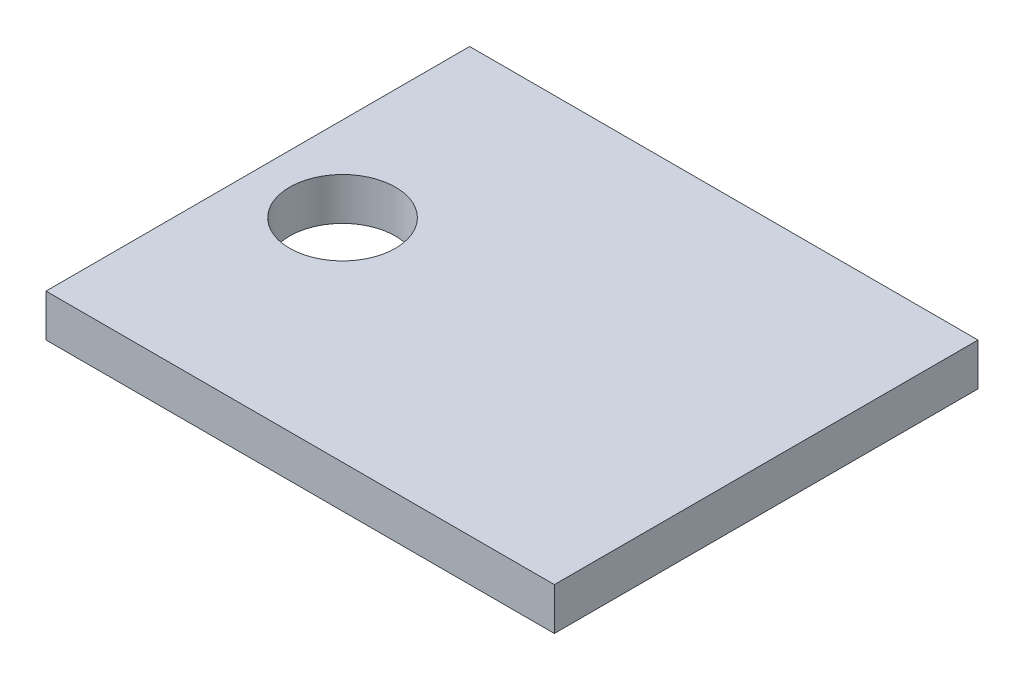
ISO-10303-21;
HEADER;
FILE_DESCRIPTION(('STEP AP214'),'2;1');
FILE_NAME('part.step','',(''),(''),'','','');
FILE_SCHEMA(('AUTOMOTIVE_DESIGN { 1 0 10303 214 1 1 1 1 }'));
ENDSEC;
DATA;
#1=APPLICATION_CONTEXT('core data for automotive mechanical design processes');
#2=APPLICATION_PROTOCOL_DEFINITION('international standard','automotive_design',2000,#1);
#3=PRODUCT_CONTEXT('',#1,'mechanical');
#4=PRODUCT('Part','Part','',(#3));
#5=PRODUCT_RELATED_PRODUCT_CATEGORY('part','',(#4));
#6=PRODUCT_DEFINITION_FORMATION('','',#4);
#7=PRODUCT_DEFINITION_CONTEXT('part definition',#1,'design');
#8=PRODUCT_DEFINITION('design','',#6,#7);
#9=PRODUCT_DEFINITION_SHAPE('','',#8);
#10=(LENGTH_UNIT() NAMED_UNIT(*) SI_UNIT(.MILLI.,.METRE.));
#11=(NAMED_UNIT(*) PLANE_ANGLE_UNIT() SI_UNIT($,.RADIAN.));
#12=(NAMED_UNIT(*) SI_UNIT($,.STERADIAN.) SOLID_ANGLE_UNIT());
#13=UNCERTAINTY_MEASURE_WITH_UNIT(LENGTH_MEASURE(1.E-05),#10,'distance_accuracy_value','');
#14=(GEOMETRIC_REPRESENTATION_CONTEXT(3) GLOBAL_UNCERTAINTY_ASSIGNED_CONTEXT((#13)) GLOBAL_UNIT_ASSIGNED_CONTEXT((#10,
#11,#12)) REPRESENTATION_CONTEXT('',''));
#15=CARTESIAN_POINT('',(0.,0.,0.));
#16=DIRECTION('',(0.,0.,1.));
#17=DIRECTION('',(1.,0.,0.));
#18=AXIS2_PLACEMENT_3D('',#15,#16,#17);
#19=CARTESIAN_POINT('',(0.,5.,0.));
#20=DIRECTION('',(0.,-1.,0.));
#21=DIRECTION('',(0.,0.,-1.));
#22=AXIS2_PLACEMENT_3D('',#19,#20,#21);
#23=PLANE('',#22);
#24=DIRECTION('',(0.,0.,-1.));
#25=VECTOR('',#24,1.);
#26=CARTESIAN_POINT('',(60.,5.,50.));
#27=LINE('',#26,#25);
#28=CARTESIAN_POINT('',(60.,5.,50.));
#29=VERTEX_POINT('',#28);
#30=CARTESIAN_POINT('',(60.,5.,-50.));
#31=VERTEX_POINT('',#30);
#32=EDGE_CURVE('E89',#29,#31,#27,.T.);
#33=ORIENTED_EDGE('',*,*,#32,.T.);
#34=DIRECTION('',(-1.,0.,0.));
#35=VECTOR('',#34,1.);
#36=CARTESIAN_POINT('',(-60.,5.,-50.));
#37=LINE('',#36,#35);
#38=CARTESIAN_POINT('',(-60.,5.,-50.));
#39=VERTEX_POINT('',#38);
#40=EDGE_CURVE('E84',#31,#39,#37,.T.);
#41=ORIENTED_EDGE('',*,*,#40,.T.);
#42=DIRECTION('',(0.,0.,1.));
#43=VECTOR('',#42,1.);
#44=CARTESIAN_POINT('',(-60.,5.,50.));
#45=LINE('',#44,#43);
#46=CARTESIAN_POINT('',(-60.,5.,50.));
#47=VERTEX_POINT('',#46);
#48=EDGE_CURVE('E87',#39,#47,#45,.T.);
#49=ORIENTED_EDGE('',*,*,#48,.T.);
#50=DIRECTION('',(1.,0.,0.));
#51=VECTOR('',#50,1.);
#52=CARTESIAN_POINT('',(-60.,5.,50.));
#53=LINE('',#52,#51);
#54=EDGE_CURVE('E54',#47,#29,#53,.T.);
#55=ORIENTED_EDGE('',*,*,#54,.T.);
#56=EDGE_LOOP('',(#33,#41,#49,#55));
#57=FACE_BOUND('',#56,.T.);
#58=CARTESIAN_POINT('',(-40.,5.,0.));
#59=DIRECTION('',(0.,1.,0.));
#60=DIRECTION('',(0.,0.,1.));
#61=AXIS2_PLACEMENT_3D('',#58,#59,#60);
#62=CIRCLE('',#61,12.5);
#63=CARTESIAN_POINT('',(-40.,5.,12.5));
#64=VERTEX_POINT('',#63);
#65=EDGE_CURVE('E104',#64,#64,#62,.T.);
#66=ORIENTED_EDGE('',*,*,#65,.F.);
#67=EDGE_LOOP('',(#66));
#68=FACE_BOUND('',#67,.T.);
#69=ADVANCED_FACE('F37',(#57,#68),#23,.F.);
#70=CARTESIAN_POINT('',(0.,-5.,0.));
#71=DIRECTION('',(0.,-1.,0.));
#72=DIRECTION('',(0.,0.,-1.));
#73=AXIS2_PLACEMENT_3D('',#70,#71,#72);
#74=PLANE('',#73);
#75=DIRECTION('',(0.,0.,-1.));
#76=VECTOR('',#75,1.);
#77=CARTESIAN_POINT('',(60.,-5.,50.));
#78=LINE('',#77,#76);
#79=CARTESIAN_POINT('',(60.,-5.,50.));
#80=VERTEX_POINT('',#79);
#81=CARTESIAN_POINT('',(60.,-5.,-50.));
#82=VERTEX_POINT('',#81);
#83=EDGE_CURVE('E101',#80,#82,#78,.T.);
#84=ORIENTED_EDGE('',*,*,#83,.F.);
#85=DIRECTION('',(1.,0.,0.));
#86=VECTOR('',#85,1.);
#87=CARTESIAN_POINT('',(-60.,-5.,50.));
#88=LINE('',#87,#86);
#89=CARTESIAN_POINT('',(-60.,-5.,50.));
#90=VERTEX_POINT('',#89);
#91=EDGE_CURVE('E77',#90,#80,#88,.T.);
#92=ORIENTED_EDGE('',*,*,#91,.F.);
#93=DIRECTION('',(0.,0.,1.));
#94=VECTOR('',#93,1.);
#95=CARTESIAN_POINT('',(-60.,-5.,50.));
#96=LINE('',#95,#94);
#97=CARTESIAN_POINT('',(-60.,-5.,-50.));
#98=VERTEX_POINT('',#97);
#99=EDGE_CURVE('E71',#98,#90,#96,.T.);
#100=ORIENTED_EDGE('',*,*,#99,.F.);
#101=DIRECTION('',(-1.,0.,0.));
#102=VECTOR('',#101,1.);
#103=CARTESIAN_POINT('',(-60.,-5.,-50.));
#104=LINE('',#103,#102);
#105=EDGE_CURVE('E93',#82,#98,#104,.T.);
#106=ORIENTED_EDGE('',*,*,#105,.F.);
#107=EDGE_LOOP('',(#84,#92,#100,#106));
#108=FACE_BOUND('',#107,.T.);
#109=CARTESIAN_POINT('',(-40.,-5.,0.));
#110=DIRECTION('',(0.,1.,0.));
#111=DIRECTION('',(0.,0.,1.));
#112=AXIS2_PLACEMENT_3D('',#109,#110,#111);
#113=CIRCLE('',#112,12.5);
#114=CARTESIAN_POINT('',(-40.,-5.,12.5));
#115=VERTEX_POINT('',#114);
#116=EDGE_CURVE('E116',#115,#115,#113,.T.);
#117=ORIENTED_EDGE('',*,*,#116,.T.);
#118=EDGE_LOOP('',(#117));
#119=FACE_BOUND('',#118,.T.);
#120=ADVANCED_FACE('F112',(#108,#119),#74,.T.);
#121=CARTESIAN_POINT('',(60.,5.,50.));
#122=DIRECTION('',(-1.,0.,0.));
#123=DIRECTION('',(0.,0.,1.));
#124=AXIS2_PLACEMENT_3D('',#121,#122,#123);
#125=PLANE('',#124);
#126=ORIENTED_EDGE('',*,*,#83,.T.);
#127=DIRECTION('',(0.,-1.,0.));
#128=VECTOR('',#127,1.);
#129=CARTESIAN_POINT('',(60.,5.,-50.));
#130=LINE('',#129,#128);
#131=EDGE_CURVE('E11',#31,#82,#130,.T.);
#132=ORIENTED_EDGE('',*,*,#131,.F.);
#133=ORIENTED_EDGE('',*,*,#32,.F.);
#134=DIRECTION('',(0.,-1.,0.));
#135=VECTOR('',#134,1.);
#136=CARTESIAN_POINT('',(60.,5.,50.));
#137=LINE('',#136,#135);
#138=EDGE_CURVE('E97',#29,#80,#137,.T.);
#139=ORIENTED_EDGE('',*,*,#138,.T.);
#140=EDGE_LOOP('',(#126,#132,#133,#139));
#141=FACE_BOUND('',#140,.T.);
#142=ADVANCED_FACE('F39',(#141),#125,.F.);
#143=CARTESIAN_POINT('',(-60.,5.,-50.));
#144=DIRECTION('',(0.,0.,1.));
#145=DIRECTION('',(1.,0.,0.));
#146=AXIS2_PLACEMENT_3D('',#143,#144,#145);
#147=PLANE('',#146);
#148=ORIENTED_EDGE('',*,*,#105,.T.);
#149=DIRECTION('',(0.,-1.,0.));
#150=VECTOR('',#149,1.);
#151=CARTESIAN_POINT('',(-60.,5.,-50.));
#152=LINE('',#151,#150);
#153=EDGE_CURVE('E46',#39,#98,#152,.T.);
#154=ORIENTED_EDGE('',*,*,#153,.F.);
#155=ORIENTED_EDGE('',*,*,#40,.F.);
#156=ORIENTED_EDGE('',*,*,#131,.T.);
#157=EDGE_LOOP('',(#148,#154,#155,#156));
#158=FACE_BOUND('',#157,.T.);
#159=ADVANCED_FACE('F92',(#158),#147,.F.);
#160=CARTESIAN_POINT('',(-60.,5.,50.));
#161=DIRECTION('',(1.,0.,0.));
#162=DIRECTION('',(0.,0.,-1.));
#163=AXIS2_PLACEMENT_3D('',#160,#161,#162);
#164=PLANE('',#163);
#165=ORIENTED_EDGE('',*,*,#99,.T.);
#166=DIRECTION('',(0.,-1.,0.));
#167=VECTOR('',#166,1.);
#168=CARTESIAN_POINT('',(-60.,5.,50.));
#169=LINE('',#168,#167);
#170=EDGE_CURVE('E94',#47,#90,#169,.T.);
#171=ORIENTED_EDGE('',*,*,#170,.F.);
#172=ORIENTED_EDGE('',*,*,#48,.F.);
#173=ORIENTED_EDGE('',*,*,#153,.T.);
#174=EDGE_LOOP('',(#165,#171,#172,#173));
#175=FACE_BOUND('',#174,.T.);
#176=ADVANCED_FACE('F95',(#175),#164,.F.);
#177=CARTESIAN_POINT('',(-60.,5.,50.));
#178=DIRECTION('',(0.,0.,-1.));
#179=DIRECTION('',(-1.,0.,0.));
#180=AXIS2_PLACEMENT_3D('',#177,#178,#179);
#181=PLANE('',#180);
#182=ORIENTED_EDGE('',*,*,#91,.T.);
#183=ORIENTED_EDGE('',*,*,#138,.F.);
#184=ORIENTED_EDGE('',*,*,#54,.F.);
#185=ORIENTED_EDGE('',*,*,#170,.T.);
#186=EDGE_LOOP('',(#182,#183,#184,#185));
#187=FACE_BOUND('',#186,.T.);
#188=ADVANCED_FACE('F109',(#187),#181,.F.);
#189=CARTESIAN_POINT('',(-40.,5.,0.));
#190=DIRECTION('',(0.,-1.,0.));
#191=DIRECTION('',(0.,0.,-1.));
#192=AXIS2_PLACEMENT_3D('',#189,#190,#191);
#193=CYLINDRICAL_SURFACE('',#192,12.5);
#194=ORIENTED_EDGE('',*,*,#65,.T.);
#195=EDGE_LOOP('',(#194));
#196=FACE_BOUND('',#195,.T.);
#197=ORIENTED_EDGE('',*,*,#116,.F.);
#198=EDGE_LOOP('',(#197));
#199=FACE_BOUND('',#198,.T.);
#200=ADVANCED_FACE('F122',(#196,#199),#193,.F.);
#201=CLOSED_SHELL('',(#69,#120,#142,#159,#176,#188,#200));
#202=MANIFOLD_SOLID_BREP('B2',#201);
#203=ADVANCED_BREP_SHAPE_REPRESENTATION('',(#18,#202),#14);
#204=SHAPE_DEFINITION_REPRESENTATION(#9,#203);
ENDSEC;
END-ISO-10303-21;
